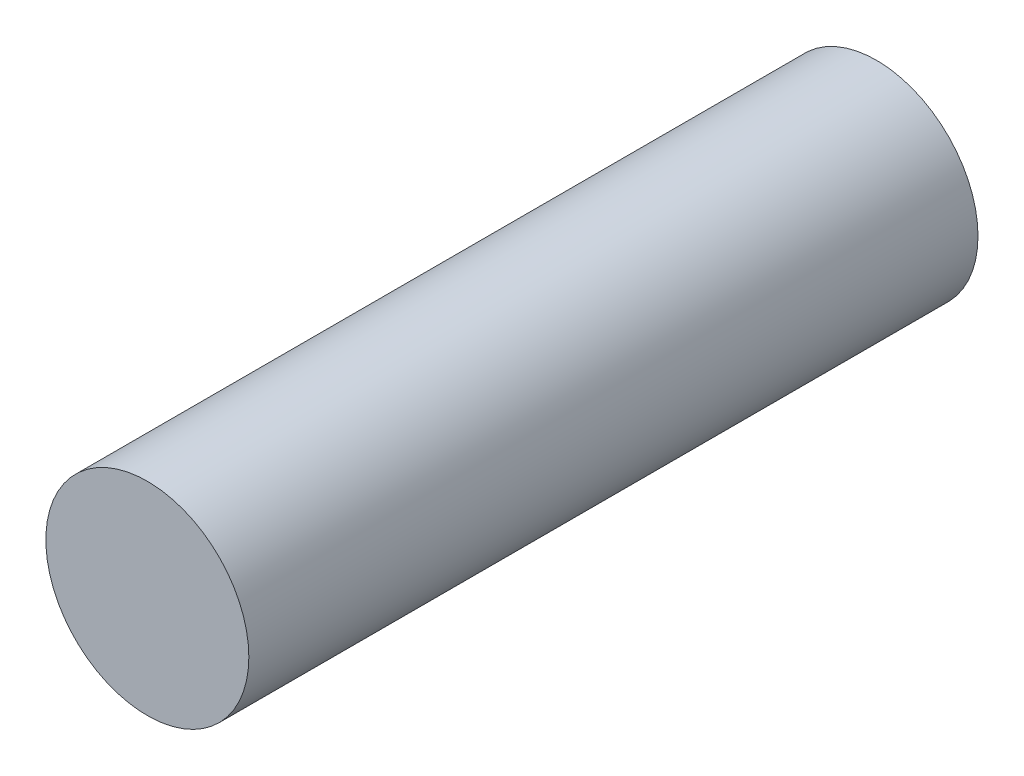
ISO-10303-21;
HEADER;
FILE_DESCRIPTION(('STEP AP214'),'2;1');
FILE_NAME('part.step','',(''),(''),'','','');
FILE_SCHEMA(('AUTOMOTIVE_DESIGN { 1 0 10303 214 1 1 1 1 }'));
ENDSEC;
DATA;
#1=APPLICATION_CONTEXT('core data for automotive mechanical design processes');
#2=APPLICATION_PROTOCOL_DEFINITION('international standard','automotive_design',2000,#1);
#3=PRODUCT_CONTEXT('',#1,'mechanical');
#4=PRODUCT('Part','Part','',(#3));
#5=PRODUCT_RELATED_PRODUCT_CATEGORY('part','',(#4));
#6=PRODUCT_DEFINITION_FORMATION('','',#4);
#7=PRODUCT_DEFINITION_CONTEXT('part definition',#1,'design');
#8=PRODUCT_DEFINITION('design','',#6,#7);
#9=PRODUCT_DEFINITION_SHAPE('','',#8);
#10=(LENGTH_UNIT() NAMED_UNIT(*) SI_UNIT(.MILLI.,.METRE.));
#11=(NAMED_UNIT(*) PLANE_ANGLE_UNIT() SI_UNIT($,.RADIAN.));
#12=(NAMED_UNIT(*) SI_UNIT($,.STERADIAN.) SOLID_ANGLE_UNIT());
#13=UNCERTAINTY_MEASURE_WITH_UNIT(LENGTH_MEASURE(1.E-05),#10,'distance_accuracy_value','');
#14=(GEOMETRIC_REPRESENTATION_CONTEXT(3) GLOBAL_UNCERTAINTY_ASSIGNED_CONTEXT((#13)) GLOBAL_UNIT_ASSIGNED_CONTEXT((#10,
#11,#12)) REPRESENTATION_CONTEXT('',''));
#15=CARTESIAN_POINT('',(0.,0.,0.));
#16=DIRECTION('',(0.,0.,1.));
#17=DIRECTION('',(1.,0.,0.));
#18=AXIS2_PLACEMENT_3D('',#15,#16,#17);
#19=CARTESIAN_POINT('',(0.,0.,176.));
#20=DIRECTION('',(0.,0.,-1.));
#21=DIRECTION('',(-1.,0.,0.));
#22=AXIS2_PLACEMENT_3D('',#19,#20,#21);
#23=CYLINDRICAL_SURFACE('',#22,24.5);
#24=CARTESIAN_POINT('',(0.,0.,176.));
#25=DIRECTION('',(0.,0.,1.));
#26=DIRECTION('',(1.,0.,0.));
#27=AXIS2_PLACEMENT_3D('',#24,#25,#26);
#28=CIRCLE('',#27,24.5);
#29=CARTESIAN_POINT('',(24.5,0.,176.));
#30=VERTEX_POINT('',#29);
#31=EDGE_CURVE('E10',#30,#30,#28,.T.);
#32=ORIENTED_EDGE('',*,*,#31,.F.);
#33=EDGE_LOOP('',(#32));
#34=FACE_BOUND('',#33,.T.);
#35=CARTESIAN_POINT('',(0.,0.,0.));
#36=DIRECTION('',(0.,0.,1.));
#37=DIRECTION('',(1.,0.,0.));
#38=AXIS2_PLACEMENT_3D('',#35,#36,#37);
#39=CIRCLE('',#38,24.5);
#40=CARTESIAN_POINT('',(24.5,0.,0.));
#41=VERTEX_POINT('',#40);
#42=EDGE_CURVE('E35',#41,#41,#39,.T.);
#43=ORIENTED_EDGE('',*,*,#42,.T.);
#44=EDGE_LOOP('',(#43));
#45=FACE_BOUND('',#44,.T.);
#46=ADVANCED_FACE('F32',(#34,#45),#23,.T.);
#47=CARTESIAN_POINT('',(0.,0.,176.));
#48=DIRECTION('',(0.,0.,1.));
#49=DIRECTION('',(1.,0.,0.));
#50=AXIS2_PLACEMENT_3D('',#47,#48,#49);
#51=PLANE('',#50);
#52=ORIENTED_EDGE('',*,*,#31,.T.);
#53=EDGE_LOOP('',(#52));
#54=FACE_BOUND('',#53,.T.);
#55=ADVANCED_FACE('F47',(#54),#51,.T.);
#56=CARTESIAN_POINT('',(0.,0.,0.));
#57=DIRECTION('',(0.,0.,1.));
#58=DIRECTION('',(1.,0.,0.));
#59=AXIS2_PLACEMENT_3D('',#56,#57,#58);
#60=PLANE('',#59);
#61=ORIENTED_EDGE('',*,*,#42,.F.);
#62=EDGE_LOOP('',(#61));
#63=FACE_BOUND('',#62,.T.);
#64=ADVANCED_FACE('F45',(#63),#60,.F.);
#65=CLOSED_SHELL('',(#46,#55,#64));
#66=MANIFOLD_SOLID_BREP('B2',#65);
#67=ADVANCED_BREP_SHAPE_REPRESENTATION('',(#18,#66),#14);
#68=SHAPE_DEFINITION_REPRESENTATION(#9,#67);
ENDSEC;
END-ISO-10303-21;
